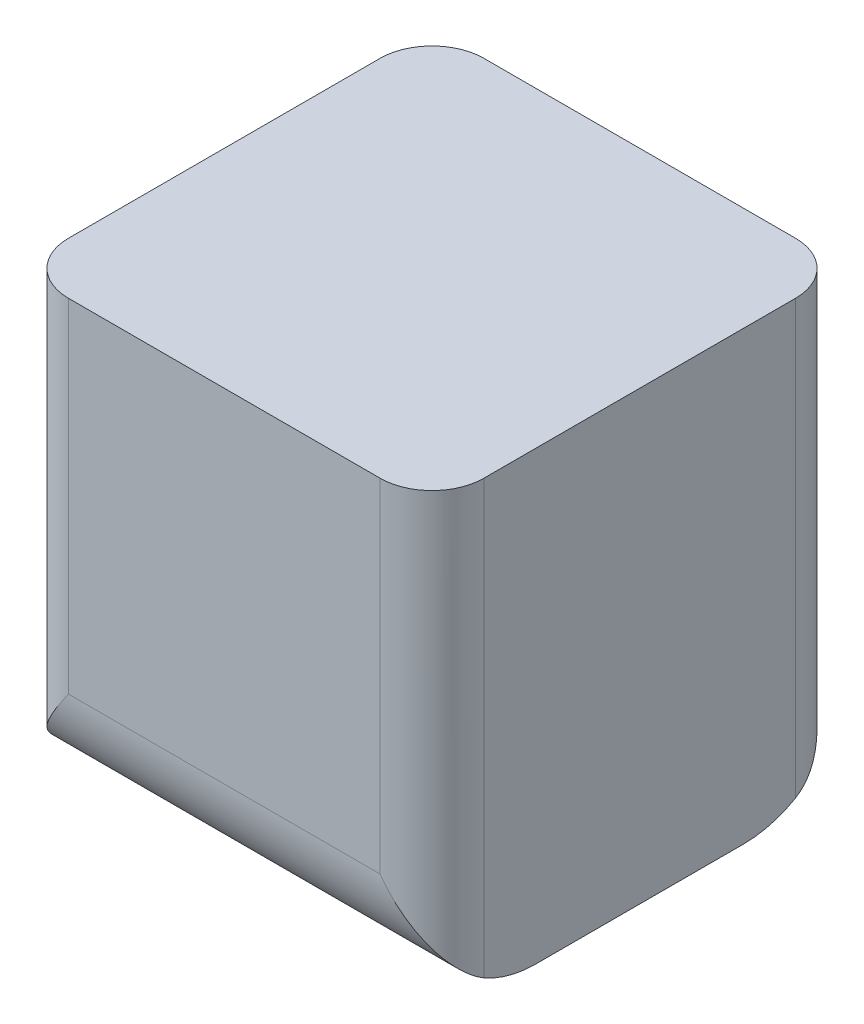
ISO-10303-21;
HEADER;
FILE_DESCRIPTION(('STEP AP214'),'2;1');
FILE_NAME('part.step','',(''),(''),'','','');
FILE_SCHEMA(('AUTOMOTIVE_DESIGN { 1 0 10303 214 1 1 1 1 }'));
ENDSEC;
DATA;
#1=APPLICATION_CONTEXT('core data for automotive mechanical design processes');
#2=APPLICATION_PROTOCOL_DEFINITION('international standard','automotive_design',2000,#1);
#3=PRODUCT_CONTEXT('',#1,'mechanical');
#4=PRODUCT('Part','Part','',(#3));
#5=PRODUCT_RELATED_PRODUCT_CATEGORY('part','',(#4));
#6=PRODUCT_DEFINITION_FORMATION('','',#4);
#7=PRODUCT_DEFINITION_CONTEXT('part definition',#1,'design');
#8=PRODUCT_DEFINITION('design','',#6,#7);
#9=PRODUCT_DEFINITION_SHAPE('','',#8);
#10=(LENGTH_UNIT() NAMED_UNIT(*) SI_UNIT(.MILLI.,.METRE.));
#11=(NAMED_UNIT(*) PLANE_ANGLE_UNIT() SI_UNIT($,.RADIAN.));
#12=(NAMED_UNIT(*) SI_UNIT($,.STERADIAN.) SOLID_ANGLE_UNIT());
#13=UNCERTAINTY_MEASURE_WITH_UNIT(LENGTH_MEASURE(1.E-05),#10,'distance_accuracy_value','');
#14=(GEOMETRIC_REPRESENTATION_CONTEXT(3) GLOBAL_UNCERTAINTY_ASSIGNED_CONTEXT((#13)) GLOBAL_UNIT_ASSIGNED_CONTEXT((#10,
#11,#12)) REPRESENTATION_CONTEXT('',''));
#15=CARTESIAN_POINT('',(0.,0.,0.));
#16=DIRECTION('',(0.,0.,1.));
#17=DIRECTION('',(1.,0.,0.));
#18=AXIS2_PLACEMENT_3D('',#15,#16,#17);
#19=CARTESIAN_POINT('',(-1.99999999999997,6.244,2.));
#20=DIRECTION('',(1.,0.,0.));
#21=DIRECTION('',(0.,1.,0.));
#22=AXIS2_PLACEMENT_3D('',#19,#20,#21);
#23=PLANE('',#22);
#24=DIRECTION('',(0.,-1.,0.));
#25=VECTOR('',#24,1.);
#26=CARTESIAN_POINT('',(-1.99999999999997,6.244,-1.5));
#27=LINE('',#26,#25);
#28=CARTESIAN_POINT('',(-1.99999999999997,6.244,-1.5));
#29=VERTEX_POINT('',#28);
#30=CARTESIAN_POINT('',(-1.99999999999997,2.07797459621556,-1.5));
#31=VERTEX_POINT('',#30);
#32=EDGE_CURVE('E182',#29,#31,#27,.T.);
#33=ORIENTED_EDGE('',*,*,#32,.T.);
#34=CARTESIAN_POINT('',(-1.99999999999997,2.944,-1.));
#35=DIRECTION('',(1.,0.,0.));
#36=DIRECTION('',(0.,1.,0.));
#37=AXIS2_PLACEMENT_3D('',#34,#35,#36);
#38=CIRCLE('',#37,1.);
#39=CARTESIAN_POINT('',(-1.99999999999997,1.944,-1.));
#40=VERTEX_POINT('',#39);
#41=EDGE_CURVE('E244',#31,#40,#38,.F.);
#42=ORIENTED_EDGE('',*,*,#41,.T.);
#43=DIRECTION('',(0.,0.,-1.));
#44=VECTOR('',#43,1.);
#45=CARTESIAN_POINT('',(-1.99999999999997,1.944,2.));
#46=LINE('',#45,#44);
#47=CARTESIAN_POINT('',(-1.99999999999997,1.944,1.));
#48=VERTEX_POINT('',#47);
#49=EDGE_CURVE('E150',#48,#40,#46,.T.);
#50=ORIENTED_EDGE('',*,*,#49,.F.);
#51=CARTESIAN_POINT('',(-1.99999999999997,2.944,1.));
#52=DIRECTION('',(1.,0.,0.));
#53=DIRECTION('',(0.,1.,0.));
#54=AXIS2_PLACEMENT_3D('',#51,#52,#53);
#55=CIRCLE('',#54,1.);
#56=CARTESIAN_POINT('',(-1.99999999999997,2.07797459621556,1.5));
#57=VERTEX_POINT('',#56);
#58=EDGE_CURVE('E228',#48,#57,#55,.F.);
#59=ORIENTED_EDGE('',*,*,#58,.T.);
#60=DIRECTION('',(0.,-1.,0.));
#61=VECTOR('',#60,1.);
#62=CARTESIAN_POINT('',(-1.99999999999997,6.244,1.5));
#63=LINE('',#62,#61);
#64=CARTESIAN_POINT('',(-1.99999999999997,6.244,1.5));
#65=VERTEX_POINT('',#64);
#66=EDGE_CURVE('E179',#57,#65,#63,.F.);
#67=ORIENTED_EDGE('',*,*,#66,.T.);
#68=DIRECTION('',(0.,0.,-1.));
#69=VECTOR('',#68,1.);
#70=CARTESIAN_POINT('',(-1.99999999999997,6.244,2.));
#71=LINE('',#70,#69);
#72=EDGE_CURVE('E146',#65,#29,#71,.T.);
#73=ORIENTED_EDGE('',*,*,#72,.T.);
#74=EDGE_LOOP('',(#33,#42,#50,#59,#67,#73));
#75=FACE_BOUND('',#74,.T.);
#76=ADVANCED_FACE('F38',(#75),#23,.F.);
#77=CARTESIAN_POINT('',(-1.99999999999997,1.944,2.));
#78=DIRECTION('',(0.,1.,0.));
#79=DIRECTION('',(0.,0.,1.));
#80=AXIS2_PLACEMENT_3D('',#77,#78,#79);
#81=PLANE('',#80);
#82=ORIENTED_EDGE('',*,*,#49,.T.);
#83=DIRECTION('',(1.,0.,0.));
#84=VECTOR('',#83,1.);
#85=CARTESIAN_POINT('',(-1.99999999999997,1.944,-1.));
#86=LINE('',#85,#84);
#87=CARTESIAN_POINT('',(2.00000000000003,1.944,-1.));
#88=VERTEX_POINT('',#87);
#89=EDGE_CURVE('E189',#40,#88,#86,.T.);
#90=ORIENTED_EDGE('',*,*,#89,.T.);
#91=DIRECTION('',(0.,0.,-1.));
#92=VECTOR('',#91,1.);
#93=CARTESIAN_POINT('',(2.00000000000003,1.944,2.));
#94=LINE('',#93,#92);
#95=CARTESIAN_POINT('',(2.00000000000003,1.944,1.));
#96=VERTEX_POINT('',#95);
#97=EDGE_CURVE('E145',#96,#88,#94,.T.);
#98=ORIENTED_EDGE('',*,*,#97,.F.);
#99=DIRECTION('',(1.,0.,0.));
#100=VECTOR('',#99,1.);
#101=CARTESIAN_POINT('',(-1.49999999999997,1.944,1.));
#102=LINE('',#101,#100);
#103=EDGE_CURVE('E186',#96,#48,#102,.F.);
#104=ORIENTED_EDGE('',*,*,#103,.T.);
#105=EDGE_LOOP('',(#82,#90,#98,#104));
#106=FACE_BOUND('',#105,.T.);
#107=ADVANCED_FACE('F268',(#106),#81,.F.);
#108=CARTESIAN_POINT('',(2.00000000000003,6.244,2.));
#109=DIRECTION('',(-1.,0.,0.));
#110=DIRECTION('',(0.,-1.,0.));
#111=AXIS2_PLACEMENT_3D('',#108,#109,#110);
#112=PLANE('',#111);
#113=ORIENTED_EDGE('',*,*,#97,.T.);
#114=CARTESIAN_POINT('',(2.00000000000003,2.944,-1.));
#115=DIRECTION('',(-1.,0.,0.));
#116=DIRECTION('',(0.,-1.,0.));
#117=AXIS2_PLACEMENT_3D('',#114,#115,#116);
#118=CIRCLE('',#117,1.);
#119=CARTESIAN_POINT('',(2.00000000000003,2.07797459621556,-1.5));
#120=VERTEX_POINT('',#119);
#121=EDGE_CURVE('E196',#88,#120,#118,.F.);
#122=ORIENTED_EDGE('',*,*,#121,.T.);
#123=DIRECTION('',(0.,1.,0.));
#124=VECTOR('',#123,1.);
#125=CARTESIAN_POINT('',(2.00000000000003,6.244,-1.5));
#126=LINE('',#125,#124);
#127=CARTESIAN_POINT('',(2.00000000000003,6.244,-1.5));
#128=VERTEX_POINT('',#127);
#129=EDGE_CURVE('E142',#120,#128,#126,.T.);
#130=ORIENTED_EDGE('',*,*,#129,.T.);
#131=DIRECTION('',(0.,0.,-1.));
#132=VECTOR('',#131,1.);
#133=CARTESIAN_POINT('',(2.00000000000003,6.244,2.));
#134=LINE('',#133,#132);
#135=CARTESIAN_POINT('',(2.00000000000003,6.244,1.5));
#136=VERTEX_POINT('',#135);
#137=EDGE_CURVE('E126',#136,#128,#134,.T.);
#138=ORIENTED_EDGE('',*,*,#137,.F.);
#139=DIRECTION('',(0.,1.,0.));
#140=VECTOR('',#139,1.);
#141=CARTESIAN_POINT('',(2.00000000000003,1.944,1.5));
#142=LINE('',#141,#140);
#143=CARTESIAN_POINT('',(2.00000000000003,2.07797459621556,1.5));
#144=VERTEX_POINT('',#143);
#145=EDGE_CURVE('E140',#136,#144,#142,.F.);
#146=ORIENTED_EDGE('',*,*,#145,.T.);
#147=CARTESIAN_POINT('',(2.00000000000003,2.944,1.));
#148=DIRECTION('',(-1.,0.,0.));
#149=DIRECTION('',(0.,-1.,0.));
#150=AXIS2_PLACEMENT_3D('',#147,#148,#149);
#151=CIRCLE('',#150,1.);
#152=EDGE_CURVE('E193',#144,#96,#151,.F.);
#153=ORIENTED_EDGE('',*,*,#152,.T.);
#154=EDGE_LOOP('',(#113,#122,#130,#138,#146,#153));
#155=FACE_BOUND('',#154,.T.);
#156=ADVANCED_FACE('F139',(#155),#112,.F.);
#157=CARTESIAN_POINT('',(-1.99999999999997,6.244,2.));
#158=DIRECTION('',(0.,-1.,0.));
#159=DIRECTION('',(0.,0.,-1.));
#160=AXIS2_PLACEMENT_3D('',#157,#158,#159);
#161=PLANE('',#160);
#162=ORIENTED_EDGE('',*,*,#137,.T.);
#163=CARTESIAN_POINT('',(1.50000000000003,6.244,-1.5));
#164=DIRECTION('',(0.,-1.,0.));
#165=DIRECTION('',(0.,0.,-1.));
#166=AXIS2_PLACEMENT_3D('',#163,#164,#165);
#167=CIRCLE('',#166,0.5);
#168=CARTESIAN_POINT('',(1.50000000000003,6.244,-2.));
#169=VERTEX_POINT('',#168);
#170=EDGE_CURVE('E133',#128,#169,#167,.F.);
#171=ORIENTED_EDGE('',*,*,#170,.T.);
#172=DIRECTION('',(-1.,0.,0.));
#173=VECTOR('',#172,1.);
#174=CARTESIAN_POINT('',(-1.99999999999997,6.244,-2.));
#175=LINE('',#174,#173);
#176=CARTESIAN_POINT('',(-1.49999999999997,6.244,-2.));
#177=VERTEX_POINT('',#176);
#178=EDGE_CURVE('E258',#169,#177,#175,.T.);
#179=ORIENTED_EDGE('',*,*,#178,.T.);
#180=CARTESIAN_POINT('',(-1.49999999999997,6.244,-1.5));
#181=DIRECTION('',(0.,-1.,0.));
#182=DIRECTION('',(0.,0.,-1.));
#183=AXIS2_PLACEMENT_3D('',#180,#181,#182);
#184=CIRCLE('',#183,0.5);
#185=EDGE_CURVE('E134',#177,#29,#184,.F.);
#186=ORIENTED_EDGE('',*,*,#185,.T.);
#187=ORIENTED_EDGE('',*,*,#72,.F.);
#188=CARTESIAN_POINT('',(-1.49999999999997,6.244,1.5));
#189=DIRECTION('',(0.,-1.,0.));
#190=DIRECTION('',(0.,0.,-1.));
#191=AXIS2_PLACEMENT_3D('',#188,#189,#190);
#192=CIRCLE('',#191,0.5);
#193=CARTESIAN_POINT('',(-1.49999999999997,6.244,2.));
#194=VERTEX_POINT('',#193);
#195=EDGE_CURVE('E154',#65,#194,#192,.F.);
#196=ORIENTED_EDGE('',*,*,#195,.T.);
#197=DIRECTION('',(-1.,0.,0.));
#198=VECTOR('',#197,1.);
#199=CARTESIAN_POINT('',(-1.99999999999997,6.244,2.));
#200=LINE('',#199,#198);
#201=CARTESIAN_POINT('',(1.50000000000003,6.244,2.));
#202=VERTEX_POINT('',#201);
#203=EDGE_CURVE('E128',#202,#194,#200,.T.);
#204=ORIENTED_EDGE('',*,*,#203,.F.);
#205=CARTESIAN_POINT('',(1.50000000000003,6.244,1.5));
#206=DIRECTION('',(0.,-1.,0.));
#207=DIRECTION('',(0.,0.,-1.));
#208=AXIS2_PLACEMENT_3D('',#205,#206,#207);
#209=CIRCLE('',#208,0.5);
#210=EDGE_CURVE('E123',#202,#136,#209,.F.);
#211=ORIENTED_EDGE('',*,*,#210,.T.);
#212=EDGE_LOOP('',(#162,#171,#179,#186,#187,#196,#204,#211));
#213=FACE_BOUND('',#212,.T.);
#214=ADVANCED_FACE('F125',(#213),#161,.F.);
#215=CARTESIAN_POINT('',(0.,0.,2.));
#216=DIRECTION('',(0.,0.,1.));
#217=DIRECTION('',(1.,0.,0.));
#218=AXIS2_PLACEMENT_3D('',#215,#216,#217);
#219=PLANE('',#218);
#220=DIRECTION('',(0.,-1.,0.));
#221=VECTOR('',#220,1.);
#222=CARTESIAN_POINT('',(-1.49999999999997,1.944,2.));
#223=LINE('',#222,#221);
#224=CARTESIAN_POINT('',(-1.49999999999997,2.944,2.));
#225=VERTEX_POINT('',#224);
#226=EDGE_CURVE('E173',#194,#225,#223,.T.);
#227=ORIENTED_EDGE('',*,*,#226,.T.);
#228=DIRECTION('',(1.,0.,0.));
#229=VECTOR('',#228,1.);
#230=CARTESIAN_POINT('',(1.50000000000003,2.944,2.));
#231=LINE('',#230,#229);
#232=CARTESIAN_POINT('',(1.50000000000003,2.944,2.));
#233=VERTEX_POINT('',#232);
#234=EDGE_CURVE('E242',#225,#233,#231,.T.);
#235=ORIENTED_EDGE('',*,*,#234,.T.);
#236=DIRECTION('',(0.,1.,0.));
#237=VECTOR('',#236,1.);
#238=CARTESIAN_POINT('',(1.50000000000003,6.244,2.));
#239=LINE('',#238,#237);
#240=EDGE_CURVE('E176',#233,#202,#239,.T.);
#241=ORIENTED_EDGE('',*,*,#240,.T.);
#242=ORIENTED_EDGE('',*,*,#203,.T.);
#243=EDGE_LOOP('',(#227,#235,#241,#242));
#244=FACE_BOUND('',#243,.T.);
#245=ADVANCED_FACE('F256',(#244),#219,.T.);
#246=CARTESIAN_POINT('',(0.,0.,-2.));
#247=DIRECTION('',(0.,0.,1.));
#248=DIRECTION('',(1.,0.,0.));
#249=AXIS2_PLACEMENT_3D('',#246,#247,#248);
#250=PLANE('',#249);
#251=DIRECTION('',(0.,1.,0.));
#252=VECTOR('',#251,1.);
#253=CARTESIAN_POINT('',(1.50000000000004,0.,-2.));
#254=LINE('',#253,#252);
#255=CARTESIAN_POINT('',(1.50000000000003,2.944,-2.));
#256=VERTEX_POINT('',#255);
#257=EDGE_CURVE('E169',#169,#256,#254,.F.);
#258=ORIENTED_EDGE('',*,*,#257,.T.);
#259=DIRECTION('',(1.,0.,0.));
#260=VECTOR('',#259,1.);
#261=CARTESIAN_POINT('',(0.,2.944,-2.));
#262=LINE('',#261,#260);
#263=CARTESIAN_POINT('',(-1.49999999999997,2.944,-2.));
#264=VERTEX_POINT('',#263);
#265=EDGE_CURVE('E207',#256,#264,#262,.F.);
#266=ORIENTED_EDGE('',*,*,#265,.T.);
#267=DIRECTION('',(0.,-1.,0.));
#268=VECTOR('',#267,1.);
#269=CARTESIAN_POINT('',(-1.49999999999997,0.,-2.));
#270=LINE('',#269,#268);
#271=EDGE_CURVE('E166',#264,#177,#270,.F.);
#272=ORIENTED_EDGE('',*,*,#271,.T.);
#273=ORIENTED_EDGE('',*,*,#178,.F.);
#274=EDGE_LOOP('',(#258,#266,#272,#273));
#275=FACE_BOUND('',#274,.T.);
#276=ADVANCED_FACE('F277',(#275),#250,.F.);
#277=CARTESIAN_POINT('',(1.50000000000003,6.244,-1.5));
#278=DIRECTION('',(0.,1.,0.));
#279=DIRECTION('',(-1.,0.,0.));
#280=AXIS2_PLACEMENT_3D('',#277,#278,#279);
#281=CYLINDRICAL_SURFACE('',#280,0.5);
#282=ORIENTED_EDGE('',*,*,#129,.F.);
#283=CARTESIAN_POINT('',(2.00000000000003,2.07797459621556,-1.5));
#284=CARTESIAN_POINT('',(1.99999927190719,2.08878441310869,-1.51873312065378));
#285=CARTESIAN_POINT('',(1.99894798687578,2.10019440434696,-1.53708210555351));
#286=CARTESIAN_POINT('',(1.99499369772322,2.1240440116747,-1.5728266322262));
#287=CARTESIAN_POINT('',(1.99209538591283,2.13648094935031,-1.59022446909962));
#288=CARTESIAN_POINT('',(1.98109578787942,2.17480699446524,-1.64038670691883));
#289=CARTESIAN_POINT('',(1.97067561405563,2.20201829049715,-1.671644875227));
#290=CARTESIAN_POINT('',(1.94287002500583,2.26435420461151,-1.73513780666692));
#291=CARTESIAN_POINT('',(1.9245356117209,2.29999858405037,-1.76642325722488));
#292=CARTESIAN_POINT('',(1.88340995189775,2.37380959288726,-1.82283390293241));
#293=CARTESIAN_POINT('',(1.86059237085411,2.41199019783472,-1.84792061894397));
#294=CARTESIAN_POINT('',(1.80216549771059,2.5057035984321,-1.90103242109897));
#295=CARTESIAN_POINT('',(1.76512017017142,2.56199679891792,-1.92612673583999));
#296=CARTESIAN_POINT('',(1.68801007931259,2.67605061205749,-1.9653175881449));
#297=CARTESIAN_POINT('',(1.64794933180025,2.73380920746868,-1.97942847841261));
#298=CARTESIAN_POINT('',(1.57300988111043,2.84073418586945,-1.99587771348021));
#299=CARTESIAN_POINT('',(1.53832255658817,2.88980323924682,-1.9997336058645));
#300=CARTESIAN_POINT('',(1.50243429016686,2.94055739292949,-1.99999555066057));
#301=CARTESIAN_POINT('',(1.50121712474546,2.94227872467815,-1.99999999436667));
#302=CARTESIAN_POINT('',(1.50000000000003,2.944,-2.));
#303=B_SPLINE_CURVE_WITH_KNOTS('',3,(#283,#284,#285,#286,#287,#288,#289,#290,#291,#292,#293,
#294,#295,#296,#297,#298,#299,#300,#301,#302),.UNSPECIFIED.,.F.,.F.,(4,2,2,2,2,2,2,2,2,4),(0.,
0.0647962104610733,0.129428460958949,0.256901938025757,0.408670619383809,0.561358997503388,
0.775938521386615,0.990237168286638,1.1703902078734,1.17671477724858),.UNSPECIFIED.);
#304=EDGE_CURVE('E199',#120,#256,#303,.T.);
#305=ORIENTED_EDGE('',*,*,#304,.T.);
#306=ORIENTED_EDGE('',*,*,#257,.F.);
#307=ORIENTED_EDGE('',*,*,#170,.F.);
#308=EDGE_LOOP('',(#282,#305,#306,#307));
#309=FACE_BOUND('',#308,.T.);
#310=ADVANCED_FACE('F209',(#309),#281,.T.);
#311=CARTESIAN_POINT('',(1.50000000000004,0.,1.5));
#312=DIRECTION('',(0.,-1.,0.));
#313=DIRECTION('',(1.,0.,0.));
#314=AXIS2_PLACEMENT_3D('',#311,#312,#313);
#315=CYLINDRICAL_SURFACE('',#314,0.5);
#316=ORIENTED_EDGE('',*,*,#240,.F.);
#317=CARTESIAN_POINT('',(2.00000000000003,2.07797459621556,1.5));
#318=CARTESIAN_POINT('',(1.99999927190719,2.08878441310869,1.51873312065378));
#319=CARTESIAN_POINT('',(1.99894798687578,2.10019440434696,1.53708210555351));
#320=CARTESIAN_POINT('',(1.99499369772322,2.1240440116747,1.5728266322262));
#321=CARTESIAN_POINT('',(1.99209538591284,2.13648094935031,1.59022446909962));
#322=CARTESIAN_POINT('',(1.98109578787942,2.17480699446523,1.64038670691883));
#323=CARTESIAN_POINT('',(1.97067561405563,2.20201829049715,1.671644875227));
#324=CARTESIAN_POINT('',(1.94287002500583,2.26435420461151,1.73513780666692));
#325=CARTESIAN_POINT('',(1.9245356117209,2.29999858405037,1.76642325722488));
#326=CARTESIAN_POINT('',(1.88340995189775,2.37380959288726,1.82283390293241));
#327=CARTESIAN_POINT('',(1.86059237085411,2.41199019783472,1.84792061894397));
#328=CARTESIAN_POINT('',(1.80216549771059,2.5057035984321,1.90103242109897));
#329=CARTESIAN_POINT('',(1.76512017017142,2.56199679891792,1.92612673583999));
#330=CARTESIAN_POINT('',(1.68801007931259,2.67605061205749,1.9653175881449));
#331=CARTESIAN_POINT('',(1.64794933180024,2.73380920746868,1.9794284784126));
#332=CARTESIAN_POINT('',(1.57300988111043,2.84073418586945,1.99587771348021));
#333=CARTESIAN_POINT('',(1.53832255658818,2.88980323924683,1.99973360586451));
#334=CARTESIAN_POINT('',(1.50243429016686,2.94055739292949,1.99999555066057));
#335=CARTESIAN_POINT('',(1.50121712474546,2.94227872467815,1.99999999436667));
#336=CARTESIAN_POINT('',(1.50000000000003,2.944,2.));
#337=B_SPLINE_CURVE_WITH_KNOTS('',3,(#317,#318,#319,#320,#321,#322,#323,#324,#325,#326,#327,
#328,#329,#330,#331,#332,#333,#334,#335,#336),.UNSPECIFIED.,.F.,.F.,(4,2,2,2,2,2,2,2,2,4),(0.,
0.0647962104610731,0.129428460958948,0.256901938025757,0.408670619383809,0.561358997503387,
0.775938521386613,0.990237168286638,1.1703902078734,1.17671477724858),.UNSPECIFIED.);
#338=EDGE_CURVE('E53',#233,#144,#337,.F.);
#339=ORIENTED_EDGE('',*,*,#338,.T.);
#340=ORIENTED_EDGE('',*,*,#145,.F.);
#341=ORIENTED_EDGE('',*,*,#210,.F.);
#342=EDGE_LOOP('',(#316,#339,#340,#341));
#343=FACE_BOUND('',#342,.T.);
#344=ADVANCED_FACE('F148',(#343),#315,.T.);
#345=CARTESIAN_POINT('',(-1.49999999999997,6.244,-1.5));
#346=DIRECTION('',(0.,-1.,0.));
#347=DIRECTION('',(1.,0.,0.));
#348=AXIS2_PLACEMENT_3D('',#345,#346,#347);
#349=CYLINDRICAL_SURFACE('',#348,0.5);
#350=ORIENTED_EDGE('',*,*,#271,.F.);
#351=CARTESIAN_POINT('',(-1.99999999999997,2.07797459621556,-1.5));
#352=CARTESIAN_POINT('',(-1.99999927190713,2.08878441310869,-1.51873312065378));
#353=CARTESIAN_POINT('',(-1.99894798687571,2.10019440434696,-1.53708210555351));
#354=CARTESIAN_POINT('',(-1.99499369772316,2.1240440116747,-1.5728266322262));
#355=CARTESIAN_POINT('',(-1.99209538591277,2.13648094935031,-1.59022446909962));
#356=CARTESIAN_POINT('',(-1.98109578787935,2.17480699446524,-1.64038670691883));
#357=CARTESIAN_POINT('',(-1.97067561405556,2.20201829049715,-1.671644875227));
#358=CARTESIAN_POINT('',(-1.94287002500577,2.26435420461151,-1.73513780666692));
#359=CARTESIAN_POINT('',(-1.92453561172083,2.29999858405037,-1.76642325722488));
#360=CARTESIAN_POINT('',(-1.88340995189769,2.37380959288726,-1.82283390293241));
#361=CARTESIAN_POINT('',(-1.86059237085405,2.41199019783472,-1.84792061894397));
#362=CARTESIAN_POINT('',(-1.80216549771053,2.5057035984321,-1.90103242109897));
#363=CARTESIAN_POINT('',(-1.76512017017136,2.56199679891792,-1.92612673583999));
#364=CARTESIAN_POINT('',(-1.68801007931252,2.67605061205749,-1.9653175881449));
#365=CARTESIAN_POINT('',(-1.64794933180018,2.73380920746868,-1.9794284784126));
#366=CARTESIAN_POINT('',(-1.57300988111037,2.84073418586945,-1.99587771348021));
#367=CARTESIAN_POINT('',(-1.53832255658811,2.88980323924683,-1.9997336058645));
#368=CARTESIAN_POINT('',(-1.5024342901668,2.94055739292949,-1.99999555066057));
#369=CARTESIAN_POINT('',(-1.50121712474539,2.94227872467815,-1.99999999436667));
#370=CARTESIAN_POINT('',(-1.49999999999997,2.944,-2.));
#371=B_SPLINE_CURVE_WITH_KNOTS('',3,(#351,#352,#353,#354,#355,#356,#357,#358,#359,#360,#361,
#362,#363,#364,#365,#366,#367,#368,#369,#370),.UNSPECIFIED.,.F.,.F.,(4,2,2,2,2,2,2,2,2,4),(0.,
0.0647962104610737,0.129428460958949,0.256901938025757,0.408670619383808,0.561358997503386,
0.775938521386612,0.990237168286635,1.1703902078734,1.17671477724858),.UNSPECIFIED.);
#372=EDGE_CURVE('E221',#264,#31,#371,.F.);
#373=ORIENTED_EDGE('',*,*,#372,.T.);
#374=ORIENTED_EDGE('',*,*,#32,.F.);
#375=ORIENTED_EDGE('',*,*,#185,.F.);
#376=EDGE_LOOP('',(#350,#373,#374,#375));
#377=FACE_BOUND('',#376,.T.);
#378=ADVANCED_FACE('F230',(#377),#349,.T.);
#379=CARTESIAN_POINT('',(-1.49999999999997,0.,1.5));
#380=DIRECTION('',(0.,1.,0.));
#381=DIRECTION('',(-1.,0.,0.));
#382=AXIS2_PLACEMENT_3D('',#379,#380,#381);
#383=CYLINDRICAL_SURFACE('',#382,0.5);
#384=ORIENTED_EDGE('',*,*,#66,.F.);
#385=CARTESIAN_POINT('',(-1.99999999999997,2.07797459621556,1.5));
#386=CARTESIAN_POINT('',(-1.99999927190713,2.08878441310869,1.51873312065378));
#387=CARTESIAN_POINT('',(-1.99894798687571,2.10019440434696,1.53708210555351));
#388=CARTESIAN_POINT('',(-1.99499369772316,2.1240440116747,1.5728266322262));
#389=CARTESIAN_POINT('',(-1.99209538591277,2.13648094935031,1.59022446909962));
#390=CARTESIAN_POINT('',(-1.98109578787935,2.17480699446523,1.64038670691883));
#391=CARTESIAN_POINT('',(-1.97067561405556,2.20201829049715,1.671644875227));
#392=CARTESIAN_POINT('',(-1.94287002500577,2.26435420461151,1.73513780666692));
#393=CARTESIAN_POINT('',(-1.92453561172083,2.29999858405037,1.76642325722488));
#394=CARTESIAN_POINT('',(-1.88340995189769,2.37380959288726,1.82283390293241));
#395=CARTESIAN_POINT('',(-1.86059237085405,2.41199019783472,1.84792061894397));
#396=CARTESIAN_POINT('',(-1.80216549771053,2.5057035984321,1.90103242109897));
#397=CARTESIAN_POINT('',(-1.76512017017136,2.56199679891792,1.92612673583999));
#398=CARTESIAN_POINT('',(-1.68801007931252,2.67605061205749,1.9653175881449));
#399=CARTESIAN_POINT('',(-1.64794933180018,2.73380920746868,1.9794284784126));
#400=CARTESIAN_POINT('',(-1.57300988111037,2.84073418586945,1.99587771348021));
#401=CARTESIAN_POINT('',(-1.53832255658811,2.88980323924683,1.99973360586451));
#402=CARTESIAN_POINT('',(-1.5024342901668,2.94055739292949,1.99999555066057));
#403=CARTESIAN_POINT('',(-1.50121712474539,2.94227872467815,1.99999999436667));
#404=CARTESIAN_POINT('',(-1.49999999999997,2.944,2.));
#405=B_SPLINE_CURVE_WITH_KNOTS('',3,(#385,#386,#387,#388,#389,#390,#391,#392,#393,#394,#395,
#396,#397,#398,#399,#400,#401,#402,#403,#404),.UNSPECIFIED.,.F.,.F.,(4,2,2,2,2,2,2,2,2,4),(0.,
0.0647962104610731,0.129428460958948,0.256901938025757,0.408670619383809,0.561358997503387,
0.775938521386611,0.990237168286636,1.1703902078734,1.17671477724858),.UNSPECIFIED.);
#406=EDGE_CURVE('E11',#57,#225,#405,.T.);
#407=ORIENTED_EDGE('',*,*,#406,.T.);
#408=ORIENTED_EDGE('',*,*,#226,.F.);
#409=ORIENTED_EDGE('',*,*,#195,.F.);
#410=EDGE_LOOP('',(#384,#407,#408,#409));
#411=FACE_BOUND('',#410,.T.);
#412=ADVANCED_FACE('F216',(#411),#383,.T.);
#413=CARTESIAN_POINT('',(-1.99999999999997,2.944,-1.));
#414=DIRECTION('',(1.,0.,0.));
#415=DIRECTION('',(0.,0.,-1.));
#416=AXIS2_PLACEMENT_3D('',#413,#414,#415);
#417=CYLINDRICAL_SURFACE('',#416,1.);
#418=ORIENTED_EDGE('',*,*,#372,.F.);
#419=ORIENTED_EDGE('',*,*,#265,.F.);
#420=ORIENTED_EDGE('',*,*,#304,.F.);
#421=ORIENTED_EDGE('',*,*,#121,.F.);
#422=ORIENTED_EDGE('',*,*,#89,.F.);
#423=ORIENTED_EDGE('',*,*,#41,.F.);
#424=EDGE_LOOP('',(#418,#419,#420,#421,#422,#423));
#425=FACE_BOUND('',#424,.T.);
#426=ADVANCED_FACE('F213',(#425),#417,.T.);
#427=CARTESIAN_POINT('',(0.,2.944,1.));
#428=DIRECTION('',(-1.,0.,0.));
#429=DIRECTION('',(0.,0.,1.));
#430=AXIS2_PLACEMENT_3D('',#427,#428,#429);
#431=CYLINDRICAL_SURFACE('',#430,1.);
#432=ORIENTED_EDGE('',*,*,#58,.F.);
#433=ORIENTED_EDGE('',*,*,#103,.F.);
#434=ORIENTED_EDGE('',*,*,#152,.F.);
#435=ORIENTED_EDGE('',*,*,#338,.F.);
#436=ORIENTED_EDGE('',*,*,#234,.F.);
#437=ORIENTED_EDGE('',*,*,#406,.F.);
#438=EDGE_LOOP('',(#432,#433,#434,#435,#436,#437));
#439=FACE_BOUND('',#438,.T.);
#440=ADVANCED_FACE('F40',(#439),#431,.T.);
#441=CLOSED_SHELL('',(#76,#107,#156,#214,#245,#276,#310,#344,#378,#412,#426,#440));
#442=MANIFOLD_SOLID_BREP('B2',#441);
#443=ADVANCED_BREP_SHAPE_REPRESENTATION('',(#18,#442),#14);
#444=SHAPE_DEFINITION_REPRESENTATION(#9,#443);
ENDSEC;
END-ISO-10303-21;
